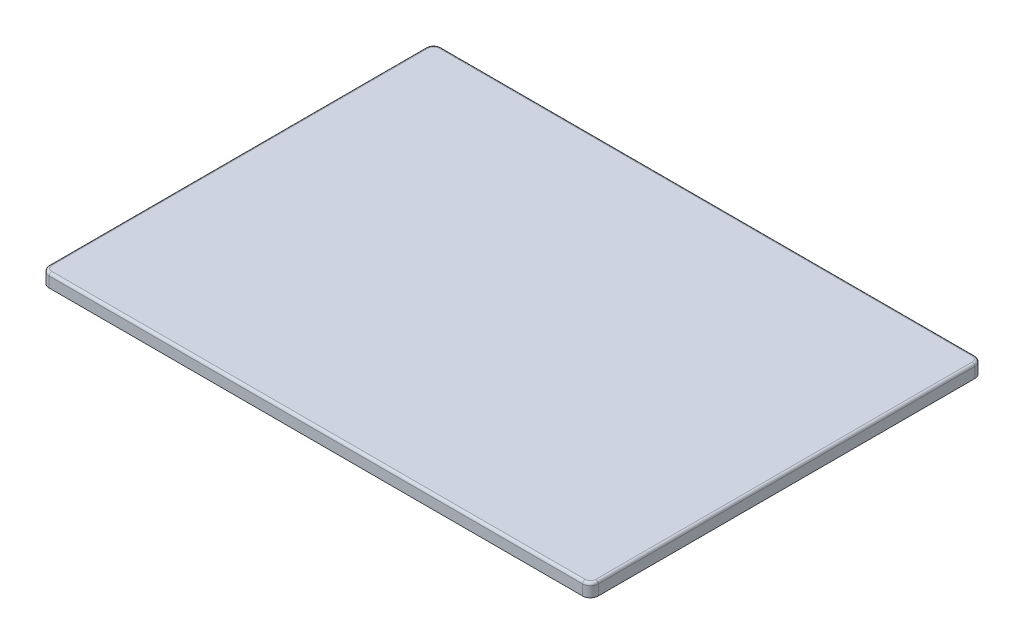
ISO-10303-21;
HEADER;
FILE_DESCRIPTION(('STEP AP214'),'2;1');
FILE_NAME('part.step','',(''),(''),'','','');
FILE_SCHEMA(('AUTOMOTIVE_DESIGN { 1 0 10303 214 1 1 1 1 }'));
ENDSEC;
DATA;
#1=APPLICATION_CONTEXT('core data for automotive mechanical design processes');
#2=APPLICATION_PROTOCOL_DEFINITION('international standard','automotive_design',2000,#1);
#3=PRODUCT_CONTEXT('',#1,'mechanical');
#4=PRODUCT('Part','Part','',(#3));
#5=PRODUCT_RELATED_PRODUCT_CATEGORY('part','',(#4));
#6=PRODUCT_DEFINITION_FORMATION('','',#4);
#7=PRODUCT_DEFINITION_CONTEXT('part definition',#1,'design');
#8=PRODUCT_DEFINITION('design','',#6,#7);
#9=PRODUCT_DEFINITION_SHAPE('','',#8);
#10=(LENGTH_UNIT() NAMED_UNIT(*) SI_UNIT(.MILLI.,.METRE.));
#11=(NAMED_UNIT(*) PLANE_ANGLE_UNIT() SI_UNIT($,.RADIAN.));
#12=(NAMED_UNIT(*) SI_UNIT($,.STERADIAN.) SOLID_ANGLE_UNIT());
#13=UNCERTAINTY_MEASURE_WITH_UNIT(LENGTH_MEASURE(1.E-05),#10,'distance_accuracy_value','');
#14=(GEOMETRIC_REPRESENTATION_CONTEXT(3) GLOBAL_UNCERTAINTY_ASSIGNED_CONTEXT((#13)) GLOBAL_UNIT_ASSIGNED_CONTEXT((#10,
#11,#12)) REPRESENTATION_CONTEXT('',''));
#15=CARTESIAN_POINT('',(0.,0.,0.));
#16=DIRECTION('',(0.,0.,1.));
#17=DIRECTION('',(1.,0.,0.));
#18=AXIS2_PLACEMENT_3D('',#15,#16,#17);
#19=CARTESIAN_POINT('',(2.00000000000004,5.,-142.));
#20=DIRECTION('',(0.,-1.,0.));
#21=DIRECTION('',(0.,0.,-1.));
#22=AXIS2_PLACEMENT_3D('',#19,#20,#21);
#23=CYLINDRICAL_SURFACE('',#22,3.);
#24=DIRECTION('',(0.,-1.,0.));
#25=VECTOR('',#24,1.);
#26=CARTESIAN_POINT('',(2.00000000000002,5.,-145.));
#27=LINE('',#26,#25);
#28=CARTESIAN_POINT('',(2.00000000000002,4.,-145.));
#29=VERTEX_POINT('',#28);
#30=CARTESIAN_POINT('',(2.00000000000002,0.,-145.));
#31=VERTEX_POINT('',#30);
#32=EDGE_CURVE('E121',#29,#31,#27,.T.);
#33=ORIENTED_EDGE('',*,*,#32,.F.);
#34=CARTESIAN_POINT('',(2.00000000000004,4.,-142.));
#35=DIRECTION('',(0.,1.,0.));
#36=DIRECTION('',(0.,0.,1.));
#37=AXIS2_PLACEMENT_3D('',#34,#35,#36);
#38=CIRCLE('',#37,3.);
#39=CARTESIAN_POINT('',(5.00000000000004,4.,-142.));
#40=VERTEX_POINT('',#39);
#41=EDGE_CURVE('E11',#29,#40,#38,.F.);
#42=ORIENTED_EDGE('',*,*,#41,.T.);
#43=DIRECTION('',(0.,-1.,0.));
#44=VECTOR('',#43,1.);
#45=CARTESIAN_POINT('',(5.00000000000004,5.,-142.));
#46=LINE('',#45,#44);
#47=CARTESIAN_POINT('',(5.00000000000004,0.,-142.));
#48=VERTEX_POINT('',#47);
#49=EDGE_CURVE('E142',#40,#48,#46,.T.);
#50=ORIENTED_EDGE('',*,*,#49,.T.);
#51=CARTESIAN_POINT('',(2.00000000000004,0.,-142.));
#52=DIRECTION('',(0.,1.,0.));
#53=DIRECTION('',(0.,0.,1.));
#54=AXIS2_PLACEMENT_3D('',#51,#52,#53);
#55=CIRCLE('',#54,3.);
#56=EDGE_CURVE('E136',#48,#31,#55,.T.);
#57=ORIENTED_EDGE('',*,*,#56,.T.);
#58=EDGE_LOOP('',(#33,#42,#50,#57));
#59=FACE_BOUND('',#58,.T.);
#60=ADVANCED_FACE('F33',(#59),#23,.T.);
#61=CARTESIAN_POINT('',(2.00000000000002,5.,-145.));
#62=DIRECTION('',(0.,0.,1.));
#63=DIRECTION('',(1.,0.,0.));
#64=AXIS2_PLACEMENT_3D('',#61,#62,#63);
#65=PLANE('',#64);
#66=DIRECTION('',(0.,-1.,0.));
#67=VECTOR('',#66,1.);
#68=CARTESIAN_POINT('',(-202.,5.,-145.));
#69=LINE('',#68,#67);
#70=CARTESIAN_POINT('',(-202.,4.,-145.));
#71=VERTEX_POINT('',#70);
#72=CARTESIAN_POINT('',(-202.,0.,-145.));
#73=VERTEX_POINT('',#72);
#74=EDGE_CURVE('E130',#71,#73,#69,.T.);
#75=ORIENTED_EDGE('',*,*,#74,.F.);
#76=DIRECTION('',(-1.,0.,0.));
#77=VECTOR('',#76,1.);
#78=CARTESIAN_POINT('',(2.00000000000002,4.,-145.));
#79=LINE('',#78,#77);
#80=EDGE_CURVE('E42',#71,#29,#79,.F.);
#81=ORIENTED_EDGE('',*,*,#80,.T.);
#82=ORIENTED_EDGE('',*,*,#32,.T.);
#83=DIRECTION('',(-1.,0.,0.));
#84=VECTOR('',#83,1.);
#85=CARTESIAN_POINT('',(2.00000000000002,0.,-145.));
#86=LINE('',#85,#84);
#87=EDGE_CURVE('E124',#31,#73,#86,.T.);
#88=ORIENTED_EDGE('',*,*,#87,.T.);
#89=EDGE_LOOP('',(#75,#81,#82,#88));
#90=FACE_BOUND('',#89,.T.);
#91=ADVANCED_FACE('F123',(#90),#65,.F.);
#92=CARTESIAN_POINT('',(-202.,5.,-142.));
#93=DIRECTION('',(0.,-1.,0.));
#94=DIRECTION('',(0.,0.,-1.));
#95=AXIS2_PLACEMENT_3D('',#92,#93,#94);
#96=CYLINDRICAL_SURFACE('',#95,3.);
#97=DIRECTION('',(0.,-1.,0.));
#98=VECTOR('',#97,1.);
#99=CARTESIAN_POINT('',(-205.,5.,-142.));
#100=LINE('',#99,#98);
#101=CARTESIAN_POINT('',(-205.,4.,-142.));
#102=VERTEX_POINT('',#101);
#103=CARTESIAN_POINT('',(-205.,0.,-142.));
#104=VERTEX_POINT('',#103);
#105=EDGE_CURVE('E172',#102,#104,#100,.T.);
#106=ORIENTED_EDGE('',*,*,#105,.F.);
#107=CARTESIAN_POINT('',(-202.,4.,-142.));
#108=DIRECTION('',(0.,1.,0.));
#109=DIRECTION('',(0.,0.,1.));
#110=AXIS2_PLACEMENT_3D('',#107,#108,#109);
#111=CIRCLE('',#110,3.);
#112=EDGE_CURVE('E57',#102,#71,#111,.F.);
#113=ORIENTED_EDGE('',*,*,#112,.T.);
#114=ORIENTED_EDGE('',*,*,#74,.T.);
#115=CARTESIAN_POINT('',(-202.,0.,-142.));
#116=DIRECTION('',(0.,1.,0.));
#117=DIRECTION('',(0.,0.,1.));
#118=AXIS2_PLACEMENT_3D('',#115,#116,#117);
#119=CIRCLE('',#118,3.);
#120=EDGE_CURVE('E139',#73,#104,#119,.T.);
#121=ORIENTED_EDGE('',*,*,#120,.T.);
#122=EDGE_LOOP('',(#106,#113,#114,#121));
#123=FACE_BOUND('',#122,.T.);
#124=ADVANCED_FACE('F275',(#123),#96,.T.);
#125=CARTESIAN_POINT('',(-205.,5.,1.99999999999998));
#126=DIRECTION('',(1.,0.,0.));
#127=DIRECTION('',(0.,0.,-1.));
#128=AXIS2_PLACEMENT_3D('',#125,#126,#127);
#129=PLANE('',#128);
#130=DIRECTION('',(0.,-1.,0.));
#131=VECTOR('',#130,1.);
#132=CARTESIAN_POINT('',(-205.,5.,1.99999999999998));
#133=LINE('',#132,#131);
#134=CARTESIAN_POINT('',(-205.,4.,1.99999999999998));
#135=VERTEX_POINT('',#134);
#136=CARTESIAN_POINT('',(-205.,0.,1.99999999999998));
#137=VERTEX_POINT('',#136);
#138=EDGE_CURVE('E170',#135,#137,#133,.T.);
#139=ORIENTED_EDGE('',*,*,#138,.F.);
#140=DIRECTION('',(0.,0.,1.));
#141=VECTOR('',#140,1.);
#142=CARTESIAN_POINT('',(-205.,4.,-142.));
#143=LINE('',#142,#141);
#144=EDGE_CURVE('E200',#135,#102,#143,.F.);
#145=ORIENTED_EDGE('',*,*,#144,.T.);
#146=ORIENTED_EDGE('',*,*,#105,.T.);
#147=DIRECTION('',(0.,0.,1.));
#148=VECTOR('',#147,1.);
#149=CARTESIAN_POINT('',(-205.,0.,1.99999999999998));
#150=LINE('',#149,#148);
#151=EDGE_CURVE('E149',#104,#137,#150,.T.);
#152=ORIENTED_EDGE('',*,*,#151,.T.);
#153=EDGE_LOOP('',(#139,#145,#146,#152));
#154=FACE_BOUND('',#153,.T.);
#155=ADVANCED_FACE('F273',(#154),#129,.F.);
#156=CARTESIAN_POINT('',(-202.,5.,2.));
#157=DIRECTION('',(0.,-1.,0.));
#158=DIRECTION('',(0.,0.,-1.));
#159=AXIS2_PLACEMENT_3D('',#156,#157,#158);
#160=CYLINDRICAL_SURFACE('',#159,3.);
#161=DIRECTION('',(0.,-1.,0.));
#162=VECTOR('',#161,1.);
#163=CARTESIAN_POINT('',(-202.,5.,5.));
#164=LINE('',#163,#162);
#165=CARTESIAN_POINT('',(-202.,4.,5.));
#166=VERTEX_POINT('',#165);
#167=CARTESIAN_POINT('',(-202.,0.,5.));
#168=VERTEX_POINT('',#167);
#169=EDGE_CURVE('E168',#166,#168,#164,.T.);
#170=ORIENTED_EDGE('',*,*,#169,.F.);
#171=CARTESIAN_POINT('',(-202.,4.,2.));
#172=DIRECTION('',(0.,1.,0.));
#173=DIRECTION('',(0.,0.,1.));
#174=AXIS2_PLACEMENT_3D('',#171,#172,#173);
#175=CIRCLE('',#174,3.);
#176=EDGE_CURVE('E198',#166,#135,#175,.F.);
#177=ORIENTED_EDGE('',*,*,#176,.T.);
#178=ORIENTED_EDGE('',*,*,#138,.T.);
#179=CARTESIAN_POINT('',(-202.,0.,2.));
#180=DIRECTION('',(0.,1.,0.));
#181=DIRECTION('',(0.,0.,-1.));
#182=AXIS2_PLACEMENT_3D('',#179,#180,#181);
#183=CIRCLE('',#182,3.);
#184=EDGE_CURVE('E152',#137,#168,#183,.T.);
#185=ORIENTED_EDGE('',*,*,#184,.T.);
#186=EDGE_LOOP('',(#170,#177,#178,#185));
#187=FACE_BOUND('',#186,.T.);
#188=ADVANCED_FACE('F271',(#187),#160,.T.);
#189=CARTESIAN_POINT('',(2.00000000000003,5.,5.));
#190=DIRECTION('',(0.,0.,-1.));
#191=DIRECTION('',(-1.,0.,0.));
#192=AXIS2_PLACEMENT_3D('',#189,#190,#191);
#193=PLANE('',#192);
#194=DIRECTION('',(0.,-1.,0.));
#195=VECTOR('',#194,1.);
#196=CARTESIAN_POINT('',(2.00000000000003,5.,5.));
#197=LINE('',#196,#195);
#198=CARTESIAN_POINT('',(2.00000000000003,4.,5.));
#199=VERTEX_POINT('',#198);
#200=CARTESIAN_POINT('',(2.00000000000003,0.,5.));
#201=VERTEX_POINT('',#200);
#202=EDGE_CURVE('E166',#199,#201,#197,.T.);
#203=ORIENTED_EDGE('',*,*,#202,.F.);
#204=DIRECTION('',(1.,0.,0.));
#205=VECTOR('',#204,1.);
#206=CARTESIAN_POINT('',(-202.,4.,5.));
#207=LINE('',#206,#205);
#208=EDGE_CURVE('E196',#199,#166,#207,.F.);
#209=ORIENTED_EDGE('',*,*,#208,.T.);
#210=ORIENTED_EDGE('',*,*,#169,.T.);
#211=DIRECTION('',(1.,0.,0.));
#212=VECTOR('',#211,1.);
#213=CARTESIAN_POINT('',(2.00000000000003,0.,5.));
#214=LINE('',#213,#212);
#215=EDGE_CURVE('E155',#168,#201,#214,.T.);
#216=ORIENTED_EDGE('',*,*,#215,.T.);
#217=EDGE_LOOP('',(#203,#209,#210,#216));
#218=FACE_BOUND('',#217,.T.);
#219=ADVANCED_FACE('F259',(#218),#193,.F.);
#220=CARTESIAN_POINT('',(2.00000000000005,5.,2.));
#221=DIRECTION('',(0.,-1.,0.));
#222=DIRECTION('',(0.,0.,-1.));
#223=AXIS2_PLACEMENT_3D('',#220,#221,#222);
#224=CYLINDRICAL_SURFACE('',#223,3.);
#225=DIRECTION('',(0.,-1.,0.));
#226=VECTOR('',#225,1.);
#227=CARTESIAN_POINT('',(5.00000000000006,5.,1.99999999999998));
#228=LINE('',#227,#226);
#229=CARTESIAN_POINT('',(5.00000000000006,4.,1.99999999999998));
#230=VERTEX_POINT('',#229);
#231=CARTESIAN_POINT('',(5.00000000000006,0.,1.99999999999998));
#232=VERTEX_POINT('',#231);
#233=EDGE_CURVE('E164',#230,#232,#228,.T.);
#234=ORIENTED_EDGE('',*,*,#233,.F.);
#235=CARTESIAN_POINT('',(2.00000000000005,4.,2.));
#236=DIRECTION('',(0.,1.,0.));
#237=DIRECTION('',(0.,0.,1.));
#238=AXIS2_PLACEMENT_3D('',#235,#236,#237);
#239=CIRCLE('',#238,3.);
#240=EDGE_CURVE('E194',#230,#199,#239,.F.);
#241=ORIENTED_EDGE('',*,*,#240,.T.);
#242=ORIENTED_EDGE('',*,*,#202,.T.);
#243=CARTESIAN_POINT('',(2.00000000000005,0.,2.));
#244=DIRECTION('',(0.,1.,0.));
#245=DIRECTION('',(0.,0.,1.));
#246=AXIS2_PLACEMENT_3D('',#243,#244,#245);
#247=CIRCLE('',#246,3.);
#248=EDGE_CURVE('E158',#201,#232,#247,.T.);
#249=ORIENTED_EDGE('',*,*,#248,.T.);
#250=EDGE_LOOP('',(#234,#241,#242,#249));
#251=FACE_BOUND('',#250,.T.);
#252=ADVANCED_FACE('F256',(#251),#224,.T.);
#253=CARTESIAN_POINT('',(5.00000000000006,5.,1.99999999999998));
#254=DIRECTION('',(-1.,0.,0.));
#255=DIRECTION('',(0.,0.,1.));
#256=AXIS2_PLACEMENT_3D('',#253,#254,#255);
#257=PLANE('',#256);
#258=ORIENTED_EDGE('',*,*,#49,.F.);
#259=DIRECTION('',(0.,0.,-1.));
#260=VECTOR('',#259,1.);
#261=CARTESIAN_POINT('',(5.00000000000006,4.,1.99999999999997));
#262=LINE('',#261,#260);
#263=EDGE_CURVE('E191',#40,#230,#262,.F.);
#264=ORIENTED_EDGE('',*,*,#263,.T.);
#265=ORIENTED_EDGE('',*,*,#233,.T.);
#266=DIRECTION('',(0.,0.,-1.));
#267=VECTOR('',#266,1.);
#268=CARTESIAN_POINT('',(5.00000000000006,0.,1.99999999999998));
#269=LINE('',#268,#267);
#270=EDGE_CURVE('E161',#232,#48,#269,.T.);
#271=ORIENTED_EDGE('',*,*,#270,.T.);
#272=EDGE_LOOP('',(#258,#264,#265,#271));
#273=FACE_BOUND('',#272,.T.);
#274=ADVANCED_FACE('F243',(#273),#257,.F.);
#275=CARTESIAN_POINT('',(2.00000000000004,5.,-142.));
#276=DIRECTION('',(0.,1.,0.));
#277=DIRECTION('',(0.,0.,1.));
#278=AXIS2_PLACEMENT_3D('',#275,#276,#277);
#279=PLANE('',#278);
#280=CARTESIAN_POINT('',(2.00000000000005,5.,2.));
#281=DIRECTION('',(0.,1.,0.));
#282=DIRECTION('',(0.,0.,1.));
#283=AXIS2_PLACEMENT_3D('',#280,#281,#282);
#284=CIRCLE('',#283,2.);
#285=CARTESIAN_POINT('',(2.00000000000004,5.,4.));
#286=VERTEX_POINT('',#285);
#287=CARTESIAN_POINT('',(4.00000000000006,5.,1.99999999999998));
#288=VERTEX_POINT('',#287);
#289=EDGE_CURVE('E186',#286,#288,#284,.T.);
#290=ORIENTED_EDGE('',*,*,#289,.T.);
#291=DIRECTION('',(0.,0.,-1.));
#292=VECTOR('',#291,1.);
#293=CARTESIAN_POINT('',(4.00000000000004,5.,-142.));
#294=LINE('',#293,#292);
#295=CARTESIAN_POINT('',(4.00000000000004,5.,-142.));
#296=VERTEX_POINT('',#295);
#297=EDGE_CURVE('E188',#288,#296,#294,.T.);
#298=ORIENTED_EDGE('',*,*,#297,.T.);
#299=CARTESIAN_POINT('',(2.00000000000004,5.,-142.));
#300=DIRECTION('',(0.,1.,0.));
#301=DIRECTION('',(0.,0.,1.));
#302=AXIS2_PLACEMENT_3D('',#299,#300,#301);
#303=CIRCLE('',#302,2.);
#304=CARTESIAN_POINT('',(2.00000000000002,5.,-144.));
#305=VERTEX_POINT('',#304);
#306=EDGE_CURVE('E129',#296,#305,#303,.T.);
#307=ORIENTED_EDGE('',*,*,#306,.T.);
#308=DIRECTION('',(-1.,0.,0.));
#309=VECTOR('',#308,1.);
#310=CARTESIAN_POINT('',(-202.,5.,-144.));
#311=LINE('',#310,#309);
#312=CARTESIAN_POINT('',(-202.,5.,-144.));
#313=VERTEX_POINT('',#312);
#314=EDGE_CURVE('E176',#305,#313,#311,.T.);
#315=ORIENTED_EDGE('',*,*,#314,.T.);
#316=CARTESIAN_POINT('',(-202.,5.,-142.));
#317=DIRECTION('',(0.,1.,0.));
#318=DIRECTION('',(0.,0.,1.));
#319=AXIS2_PLACEMENT_3D('',#316,#317,#318);
#320=CIRCLE('',#319,2.);
#321=CARTESIAN_POINT('',(-204.,5.,-142.));
#322=VERTEX_POINT('',#321);
#323=EDGE_CURVE('E178',#313,#322,#320,.T.);
#324=ORIENTED_EDGE('',*,*,#323,.T.);
#325=DIRECTION('',(0.,0.,1.));
#326=VECTOR('',#325,1.);
#327=CARTESIAN_POINT('',(-204.,5.,1.99999999999997));
#328=LINE('',#327,#326);
#329=CARTESIAN_POINT('',(-204.,5.,1.99999999999999));
#330=VERTEX_POINT('',#329);
#331=EDGE_CURVE('E180',#322,#330,#328,.T.);
#332=ORIENTED_EDGE('',*,*,#331,.T.);
#333=CARTESIAN_POINT('',(-202.,5.,2.));
#334=DIRECTION('',(0.,1.,0.));
#335=DIRECTION('',(0.,0.,1.));
#336=AXIS2_PLACEMENT_3D('',#333,#334,#335);
#337=CIRCLE('',#336,2.);
#338=CARTESIAN_POINT('',(-202.,5.,4.));
#339=VERTEX_POINT('',#338);
#340=EDGE_CURVE('E182',#330,#339,#337,.T.);
#341=ORIENTED_EDGE('',*,*,#340,.T.);
#342=DIRECTION('',(1.,0.,0.));
#343=VECTOR('',#342,1.);
#344=CARTESIAN_POINT('',(2.00000000000003,5.,4.));
#345=LINE('',#344,#343);
#346=EDGE_CURVE('E184',#339,#286,#345,.T.);
#347=ORIENTED_EDGE('',*,*,#346,.T.);
#348=EDGE_LOOP('',(#290,#298,#307,#315,#324,#332,#341,#347));
#349=FACE_BOUND('',#348,.T.);
#350=ADVANCED_FACE('F231',(#349),#279,.T.);
#351=CARTESIAN_POINT('',(2.00000000000004,0.,-142.));
#352=DIRECTION('',(0.,1.,0.));
#353=DIRECTION('',(0.,0.,1.));
#354=AXIS2_PLACEMENT_3D('',#351,#352,#353);
#355=PLANE('',#354);
#356=ORIENTED_EDGE('',*,*,#56,.F.);
#357=ORIENTED_EDGE('',*,*,#270,.F.);
#358=ORIENTED_EDGE('',*,*,#248,.F.);
#359=ORIENTED_EDGE('',*,*,#215,.F.);
#360=ORIENTED_EDGE('',*,*,#184,.F.);
#361=ORIENTED_EDGE('',*,*,#151,.F.);
#362=ORIENTED_EDGE('',*,*,#120,.F.);
#363=ORIENTED_EDGE('',*,*,#87,.F.);
#364=EDGE_LOOP('',(#356,#357,#358,#359,#360,#361,#362,#363));
#365=FACE_BOUND('',#364,.T.);
#366=ADVANCED_FACE('F134',(#365),#355,.F.);
#367=CARTESIAN_POINT('',(-204.,4.,-142.));
#368=DIRECTION('',(0.,0.,-1.));
#369=DIRECTION('',(-1.,0.,0.));
#370=AXIS2_PLACEMENT_3D('',#367,#368,#369);
#371=CYLINDRICAL_SURFACE('',#370,1.);
#372=CARTESIAN_POINT('',(-204.,4.,-142.));
#373=DIRECTION('',(0.,0.,-1.));
#374=DIRECTION('',(-1.,0.,0.));
#375=AXIS2_PLACEMENT_3D('',#372,#373,#374);
#376=CIRCLE('',#375,1.);
#377=EDGE_CURVE('E146',#102,#322,#376,.T.);
#378=ORIENTED_EDGE('',*,*,#377,.F.);
#379=ORIENTED_EDGE('',*,*,#144,.F.);
#380=CARTESIAN_POINT('',(-204.,4.,1.99999999999999));
#381=DIRECTION('',(0.,0.,1.));
#382=DIRECTION('',(1.,0.,0.));
#383=AXIS2_PLACEMENT_3D('',#380,#381,#382);
#384=CIRCLE('',#383,1.);
#385=EDGE_CURVE('E37',#330,#135,#384,.T.);
#386=ORIENTED_EDGE('',*,*,#385,.F.);
#387=ORIENTED_EDGE('',*,*,#331,.F.);
#388=EDGE_LOOP('',(#378,#379,#386,#387));
#389=FACE_BOUND('',#388,.T.);
#390=ADVANCED_FACE('F35',(#389),#371,.T.);
#391=CARTESIAN_POINT('',(-202.,4.,2.));
#392=DIRECTION('',(0.,1.,0.));
#393=DIRECTION('',(0.,0.,1.));
#394=AXIS2_PLACEMENT_3D('',#391,#392,#393);
#395=TOROIDAL_SURFACE('',#394,2.,1.);
#396=ORIENTED_EDGE('',*,*,#385,.T.);
#397=ORIENTED_EDGE('',*,*,#176,.F.);
#398=CARTESIAN_POINT('',(-202.,4.,4.));
#399=DIRECTION('',(1.,0.,0.));
#400=DIRECTION('',(0.,0.,-1.));
#401=AXIS2_PLACEMENT_3D('',#398,#399,#400);
#402=CIRCLE('',#401,1.);
#403=EDGE_CURVE('E217',#339,#166,#402,.T.);
#404=ORIENTED_EDGE('',*,*,#403,.F.);
#405=ORIENTED_EDGE('',*,*,#340,.F.);
#406=EDGE_LOOP('',(#396,#397,#404,#405));
#407=FACE_BOUND('',#406,.T.);
#408=ADVANCED_FACE('F268',(#407),#395,.T.);
#409=CARTESIAN_POINT('',(-202.,4.,-142.));
#410=DIRECTION('',(0.,1.,0.));
#411=DIRECTION('',(0.,0.,1.));
#412=AXIS2_PLACEMENT_3D('',#409,#410,#411);
#413=TOROIDAL_SURFACE('',#412,2.,1.);
#414=ORIENTED_EDGE('',*,*,#377,.T.);
#415=ORIENTED_EDGE('',*,*,#323,.F.);
#416=CARTESIAN_POINT('',(-202.,4.,-144.));
#417=DIRECTION('',(1.,0.,0.));
#418=DIRECTION('',(0.,0.,-1.));
#419=AXIS2_PLACEMENT_3D('',#416,#417,#418);
#420=CIRCLE('',#419,1.);
#421=EDGE_CURVE('E214',#71,#313,#420,.T.);
#422=ORIENTED_EDGE('',*,*,#421,.F.);
#423=ORIENTED_EDGE('',*,*,#112,.F.);
#424=EDGE_LOOP('',(#414,#415,#422,#423));
#425=FACE_BOUND('',#424,.T.);
#426=ADVANCED_FACE('F223',(#425),#413,.T.);
#427=CARTESIAN_POINT('',(2.00000000000004,4.,4.));
#428=DIRECTION('',(-1.,0.,0.));
#429=DIRECTION('',(0.,0.,1.));
#430=AXIS2_PLACEMENT_3D('',#427,#428,#429);
#431=CYLINDRICAL_SURFACE('',#430,1.);
#432=ORIENTED_EDGE('',*,*,#403,.T.);
#433=ORIENTED_EDGE('',*,*,#208,.F.);
#434=CARTESIAN_POINT('',(2.00000000000004,4.,4.));
#435=DIRECTION('',(1.,0.,0.));
#436=DIRECTION('',(0.,0.,-1.));
#437=AXIS2_PLACEMENT_3D('',#434,#435,#436);
#438=CIRCLE('',#437,1.);
#439=EDGE_CURVE('E211',#286,#199,#438,.T.);
#440=ORIENTED_EDGE('',*,*,#439,.F.);
#441=ORIENTED_EDGE('',*,*,#346,.F.);
#442=EDGE_LOOP('',(#432,#433,#440,#441));
#443=FACE_BOUND('',#442,.T.);
#444=ADVANCED_FACE('F264',(#443),#431,.T.);
#445=CARTESIAN_POINT('',(2.00000000000004,4.,-144.));
#446=DIRECTION('',(1.,0.,0.));
#447=DIRECTION('',(0.,0.,-1.));
#448=AXIS2_PLACEMENT_3D('',#445,#446,#447);
#449=CYLINDRICAL_SURFACE('',#448,1.);
#450=ORIENTED_EDGE('',*,*,#421,.T.);
#451=ORIENTED_EDGE('',*,*,#314,.F.);
#452=CARTESIAN_POINT('',(2.00000000000002,4.,-144.));
#453=DIRECTION('',(1.,0.,0.));
#454=DIRECTION('',(0.,0.,-1.));
#455=AXIS2_PLACEMENT_3D('',#452,#453,#454);
#456=CIRCLE('',#455,1.);
#457=EDGE_CURVE('E208',#29,#305,#456,.T.);
#458=ORIENTED_EDGE('',*,*,#457,.F.);
#459=ORIENTED_EDGE('',*,*,#80,.F.);
#460=EDGE_LOOP('',(#450,#451,#458,#459));
#461=FACE_BOUND('',#460,.T.);
#462=ADVANCED_FACE('F236',(#461),#449,.T.);
#463=CARTESIAN_POINT('',(2.00000000000005,4.,2.));
#464=DIRECTION('',(0.,1.,0.));
#465=DIRECTION('',(0.,0.,1.));
#466=AXIS2_PLACEMENT_3D('',#463,#464,#465);
#467=TOROIDAL_SURFACE('',#466,2.,1.);
#468=ORIENTED_EDGE('',*,*,#439,.T.);
#469=ORIENTED_EDGE('',*,*,#240,.F.);
#470=CARTESIAN_POINT('',(4.00000000000006,4.,1.99999999999998));
#471=DIRECTION('',(0.,0.,-1.));
#472=DIRECTION('',(-1.,0.,0.));
#473=AXIS2_PLACEMENT_3D('',#470,#471,#472);
#474=CIRCLE('',#473,1.);
#475=EDGE_CURVE('E206',#288,#230,#474,.T.);
#476=ORIENTED_EDGE('',*,*,#475,.F.);
#477=ORIENTED_EDGE('',*,*,#289,.F.);
#478=EDGE_LOOP('',(#468,#469,#476,#477));
#479=FACE_BOUND('',#478,.T.);
#480=ADVANCED_FACE('F252',(#479),#467,.T.);
#481=CARTESIAN_POINT('',(2.00000000000004,4.,-142.));
#482=DIRECTION('',(0.,1.,0.));
#483=DIRECTION('',(0.,0.,1.));
#484=AXIS2_PLACEMENT_3D('',#481,#482,#483);
#485=TOROIDAL_SURFACE('',#484,2.,1.);
#486=ORIENTED_EDGE('',*,*,#457,.T.);
#487=ORIENTED_EDGE('',*,*,#306,.F.);
#488=CARTESIAN_POINT('',(4.00000000000004,4.,-142.));
#489=DIRECTION('',(0.,0.,1.));
#490=DIRECTION('',(1.,0.,0.));
#491=AXIS2_PLACEMENT_3D('',#488,#489,#490);
#492=CIRCLE('',#491,1.);
#493=EDGE_CURVE('E204',#40,#296,#492,.T.);
#494=ORIENTED_EDGE('',*,*,#493,.F.);
#495=ORIENTED_EDGE('',*,*,#41,.F.);
#496=EDGE_LOOP('',(#486,#487,#494,#495));
#497=FACE_BOUND('',#496,.T.);
#498=ADVANCED_FACE('F239',(#497),#485,.T.);
#499=CARTESIAN_POINT('',(4.00000000000004,4.,-142.));
#500=DIRECTION('',(0.,0.,1.));
#501=DIRECTION('',(1.,0.,0.));
#502=AXIS2_PLACEMENT_3D('',#499,#500,#501);
#503=CYLINDRICAL_SURFACE('',#502,1.);
#504=ORIENTED_EDGE('',*,*,#475,.T.);
#505=ORIENTED_EDGE('',*,*,#263,.F.);
#506=ORIENTED_EDGE('',*,*,#493,.T.);
#507=ORIENTED_EDGE('',*,*,#297,.F.);
#508=EDGE_LOOP('',(#504,#505,#506,#507));
#509=FACE_BOUND('',#508,.T.);
#510=ADVANCED_FACE('F246',(#509),#503,.T.);
#511=CLOSED_SHELL('',(#60,#91,#124,#155,#188,#219,#252,#274,#350,#366,#390,#408,#426,#444,#462,
#480,#498,#510));
#512=MANIFOLD_SOLID_BREP('B2',#511);
#513=ADVANCED_BREP_SHAPE_REPRESENTATION('',(#18,#512),#14);
#514=SHAPE_DEFINITION_REPRESENTATION(#9,#513);
ENDSEC;
END-ISO-10303-21;
